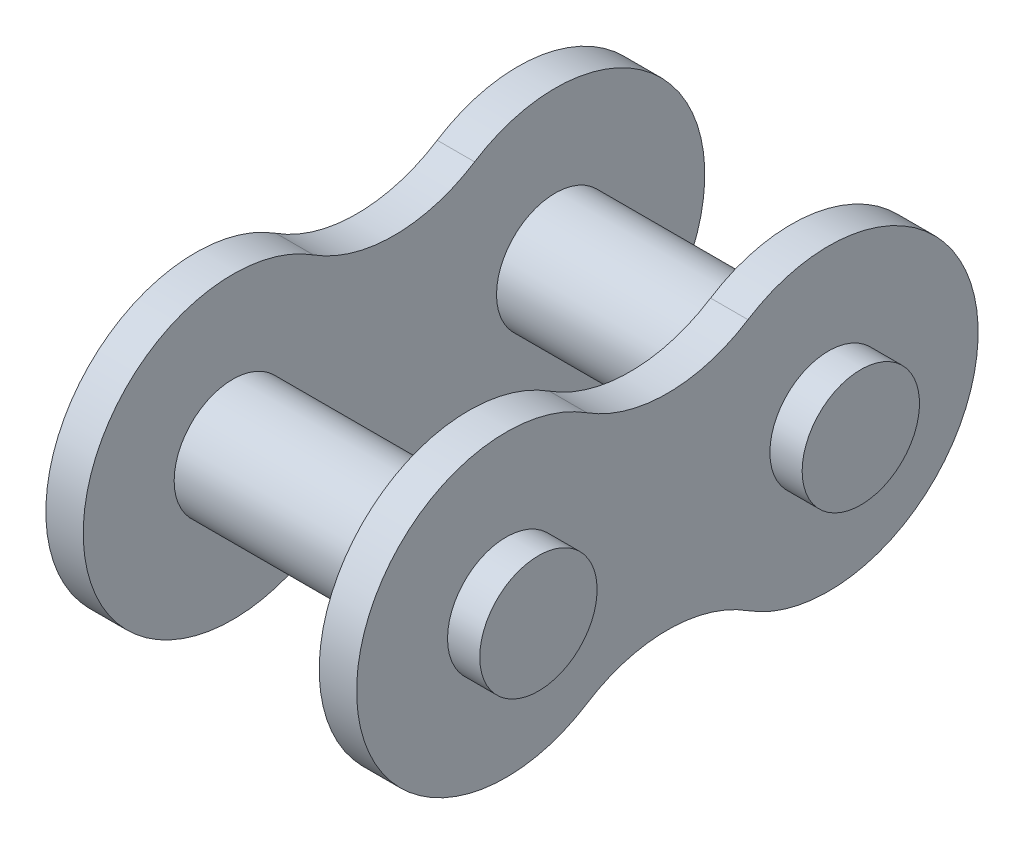
ISO-10303-21;
HEADER;
FILE_DESCRIPTION(('STEP AP214'),'2;1');
FILE_NAME('part.step','',(''),(''),'','','');
FILE_SCHEMA(('AUTOMOTIVE_DESIGN { 1 0 10303 214 1 1 1 1 }'));
ENDSEC;
DATA;
#1=APPLICATION_CONTEXT('core data for automotive mechanical design processes');
#2=APPLICATION_PROTOCOL_DEFINITION('international standard','automotive_design',2000,#1);
#3=PRODUCT_CONTEXT('',#1,'mechanical');
#4=PRODUCT('Part','Part','',(#3));
#5=PRODUCT_RELATED_PRODUCT_CATEGORY('part','',(#4));
#6=PRODUCT_DEFINITION_FORMATION('','',#4);
#7=PRODUCT_DEFINITION_CONTEXT('part definition',#1,'design');
#8=PRODUCT_DEFINITION('design','',#6,#7);
#9=PRODUCT_DEFINITION_SHAPE('','',#8);
#10=(LENGTH_UNIT() NAMED_UNIT(*) SI_UNIT(.MILLI.,.METRE.));
#11=(NAMED_UNIT(*) PLANE_ANGLE_UNIT() SI_UNIT($,.RADIAN.));
#12=(NAMED_UNIT(*) SI_UNIT($,.STERADIAN.) SOLID_ANGLE_UNIT());
#13=UNCERTAINTY_MEASURE_WITH_UNIT(LENGTH_MEASURE(1.E-05),#10,'distance_accuracy_value','');
#14=(GEOMETRIC_REPRESENTATION_CONTEXT(3) GLOBAL_UNCERTAINTY_ASSIGNED_CONTEXT((#13)) GLOBAL_UNIT_ASSIGNED_CONTEXT((#10,
#11,#12)) REPRESENTATION_CONTEXT('',''));
#15=CARTESIAN_POINT('',(0.,0.,0.));
#16=DIRECTION('',(0.,0.,1.));
#17=DIRECTION('',(1.,0.,0.));
#18=AXIS2_PLACEMENT_3D('',#15,#16,#17);
#19=CARTESIAN_POINT('',(0.7366,4.96431937328774,-3.175));
#20=DIRECTION('',(-1.,0.,0.));
#21=DIRECTION('',(0.,0.,1.));
#22=AXIS2_PLACEMENT_3D('',#19,#20,#21);
#23=CYLINDRICAL_SURFACE('',#22,2.9464);
#24=CARTESIAN_POINT('',(0.,4.96431937328774,-3.175));
#25=DIRECTION('',(-1.,0.,0.));
#26=DIRECTION('',(0.,0.,-1.));
#27=AXIS2_PLACEMENT_3D('',#24,#25,#26);
#28=CIRCLE('',#27,2.9464);
#29=CARTESIAN_POINT('',(0.,2.48215968664387,-4.7625));
#30=VERTEX_POINT('',#29);
#31=CARTESIAN_POINT('',(0.,2.48215968664387,-1.5875));
#32=VERTEX_POINT('',#31);
#33=EDGE_CURVE('E174',#30,#32,#28,.T.);
#34=ORIENTED_EDGE('',*,*,#33,.T.);
#35=DIRECTION('',(-1.,0.,0.));
#36=VECTOR('',#35,1.);
#37=CARTESIAN_POINT('',(0.7366,2.48215968664387,-1.5875));
#38=LINE('',#37,#36);
#39=CARTESIAN_POINT('',(0.7366,2.48215968664387,-1.5875));
#40=VERTEX_POINT('',#39);
#41=EDGE_CURVE('E195',#40,#32,#38,.T.);
#42=ORIENTED_EDGE('',*,*,#41,.F.);
#43=CARTESIAN_POINT('',(0.7366,4.96431937328774,-3.175));
#44=DIRECTION('',(-1.,0.,0.));
#45=DIRECTION('',(0.,0.,-1.));
#46=AXIS2_PLACEMENT_3D('',#43,#44,#45);
#47=CIRCLE('',#46,2.9464);
#48=CARTESIAN_POINT('',(0.7366,2.48215968664387,-4.7625));
#49=VERTEX_POINT('',#48);
#50=EDGE_CURVE('E177',#49,#40,#47,.T.);
#51=ORIENTED_EDGE('',*,*,#50,.F.);
#52=DIRECTION('',(-1.,0.,0.));
#53=VECTOR('',#52,1.);
#54=CARTESIAN_POINT('',(0.7366,2.48215968664387,-4.7625));
#55=LINE('',#54,#53);
#56=EDGE_CURVE('E183',#49,#30,#55,.T.);
#57=ORIENTED_EDGE('',*,*,#56,.T.);
#58=EDGE_LOOP('',(#34,#42,#51,#57));
#59=FACE_BOUND('',#58,.T.);
#60=ADVANCED_FACE('F39',(#59),#23,.F.);
#61=CARTESIAN_POINT('',(0.7366,0.,0.));
#62=DIRECTION('',(-1.,0.,0.));
#63=DIRECTION('',(0.,0.,1.));
#64=AXIS2_PLACEMENT_3D('',#61,#62,#63);
#65=CYLINDRICAL_SURFACE('',#64,2.9464);
#66=CARTESIAN_POINT('',(0.,0.,0.));
#67=DIRECTION('',(1.,0.,0.));
#68=DIRECTION('',(0.,0.,-1.));
#69=AXIS2_PLACEMENT_3D('',#66,#67,#68);
#70=CIRCLE('',#69,2.9464);
#71=CARTESIAN_POINT('',(0.,-2.48215968664387,-1.5875));
#72=VERTEX_POINT('',#71);
#73=EDGE_CURVE('E186',#32,#72,#70,.T.);
#74=ORIENTED_EDGE('',*,*,#73,.T.);
#75=DIRECTION('',(-1.,0.,0.));
#76=VECTOR('',#75,1.);
#77=CARTESIAN_POINT('',(0.7366,-2.48215968664387,-1.5875));
#78=LINE('',#77,#76);
#79=CARTESIAN_POINT('',(0.7366,-2.48215968664387,-1.5875));
#80=VERTEX_POINT('',#79);
#81=EDGE_CURVE('E193',#80,#72,#78,.T.);
#82=ORIENTED_EDGE('',*,*,#81,.F.);
#83=CARTESIAN_POINT('',(0.7366,0.,0.));
#84=DIRECTION('',(1.,0.,0.));
#85=DIRECTION('',(0.,0.,-1.));
#86=AXIS2_PLACEMENT_3D('',#83,#84,#85);
#87=CIRCLE('',#86,2.9464);
#88=EDGE_CURVE('E87',#40,#80,#87,.T.);
#89=ORIENTED_EDGE('',*,*,#88,.F.);
#90=ORIENTED_EDGE('',*,*,#41,.T.);
#91=EDGE_LOOP('',(#74,#82,#89,#90));
#92=FACE_BOUND('',#91,.T.);
#93=ADVANCED_FACE('F215',(#92),#65,.T.);
#94=CARTESIAN_POINT('',(0.7366,-4.96431937328774,-3.175));
#95=DIRECTION('',(-1.,0.,0.));
#96=DIRECTION('',(0.,0.,1.));
#97=AXIS2_PLACEMENT_3D('',#94,#95,#96);
#98=CYLINDRICAL_SURFACE('',#97,2.9464);
#99=CARTESIAN_POINT('',(0.,-4.96431937328774,-3.175));
#100=DIRECTION('',(-1.,0.,0.));
#101=DIRECTION('',(0.,0.,1.));
#102=AXIS2_PLACEMENT_3D('',#99,#100,#101);
#103=CIRCLE('',#102,2.9464);
#104=CARTESIAN_POINT('',(0.,-2.48215968664387,-4.7625));
#105=VERTEX_POINT('',#104);
#106=EDGE_CURVE('E73',#72,#105,#103,.T.);
#107=ORIENTED_EDGE('',*,*,#106,.T.);
#108=DIRECTION('',(-1.,0.,0.));
#109=VECTOR('',#108,1.);
#110=CARTESIAN_POINT('',(0.7366,-2.48215968664387,-4.7625));
#111=LINE('',#110,#109);
#112=CARTESIAN_POINT('',(0.7366,-2.48215968664387,-4.7625));
#113=VERTEX_POINT('',#112);
#114=EDGE_CURVE('E191',#113,#105,#111,.T.);
#115=ORIENTED_EDGE('',*,*,#114,.F.);
#116=CARTESIAN_POINT('',(0.7366,-4.96431937328774,-3.175));
#117=DIRECTION('',(-1.,0.,0.));
#118=DIRECTION('',(0.,0.,1.));
#119=AXIS2_PLACEMENT_3D('',#116,#117,#118);
#120=CIRCLE('',#119,2.9464);
#121=EDGE_CURVE('E180',#80,#113,#120,.T.);
#122=ORIENTED_EDGE('',*,*,#121,.F.);
#123=ORIENTED_EDGE('',*,*,#81,.T.);
#124=EDGE_LOOP('',(#107,#115,#122,#123));
#125=FACE_BOUND('',#124,.T.);
#126=ADVANCED_FACE('F214',(#125),#98,.F.);
#127=CARTESIAN_POINT('',(0.7366,0.,-6.35));
#128=DIRECTION('',(-1.,0.,0.));
#129=DIRECTION('',(0.,0.,1.));
#130=AXIS2_PLACEMENT_3D('',#127,#128,#129);
#131=CYLINDRICAL_SURFACE('',#130,2.9464);
#132=CARTESIAN_POINT('',(0.,0.,-6.35));
#133=DIRECTION('',(1.,0.,0.));
#134=DIRECTION('',(0.,0.,-1.));
#135=AXIS2_PLACEMENT_3D('',#132,#133,#134);
#136=CIRCLE('',#135,2.9464);
#137=EDGE_CURVE('E79',#105,#30,#136,.T.);
#138=ORIENTED_EDGE('',*,*,#137,.T.);
#139=ORIENTED_EDGE('',*,*,#56,.F.);
#140=CARTESIAN_POINT('',(0.7366,0.,-6.35));
#141=DIRECTION('',(1.,0.,0.));
#142=DIRECTION('',(0.,0.,-1.));
#143=AXIS2_PLACEMENT_3D('',#140,#141,#142);
#144=CIRCLE('',#143,2.9464);
#145=EDGE_CURVE('E55',#113,#49,#144,.T.);
#146=ORIENTED_EDGE('',*,*,#145,.F.);
#147=ORIENTED_EDGE('',*,*,#114,.T.);
#148=EDGE_LOOP('',(#138,#139,#146,#147));
#149=FACE_BOUND('',#148,.T.);
#150=ADVANCED_FACE('F212',(#149),#131,.T.);
#151=CARTESIAN_POINT('',(0.7366,2.48215968664387,-4.7625));
#152=DIRECTION('',(1.,0.,0.));
#153=DIRECTION('',(0.,0.,-1.));
#154=AXIS2_PLACEMENT_3D('',#151,#152,#153);
#155=PLANE('',#154);
#156=CARTESIAN_POINT('',(0.7366,0.,-6.35));
#157=DIRECTION('',(1.,0.,0.));
#158=DIRECTION('',(0.,0.,-1.));
#159=AXIS2_PLACEMENT_3D('',#156,#157,#158);
#160=CIRCLE('',#159,1.1557);
#161=CARTESIAN_POINT('',(0.7366,0.,-5.1943));
#162=VERTEX_POINT('',#161);
#163=EDGE_CURVE('E165',#162,#162,#160,.T.);
#164=ORIENTED_EDGE('',*,*,#163,.F.);
#165=EDGE_LOOP('',(#164));
#166=FACE_BOUND('',#165,.T.);
#167=CARTESIAN_POINT('',(0.7366,0.,0.));
#168=DIRECTION('',(1.,0.,0.));
#169=DIRECTION('',(0.,0.,-1.));
#170=AXIS2_PLACEMENT_3D('',#167,#168,#169);
#171=CIRCLE('',#170,1.1557);
#172=CARTESIAN_POINT('',(0.7366,0.,1.1557));
#173=VERTEX_POINT('',#172);
#174=EDGE_CURVE('E168',#173,#173,#171,.T.);
#175=ORIENTED_EDGE('',*,*,#174,.F.);
#176=EDGE_LOOP('',(#175));
#177=FACE_BOUND('',#176,.T.);
#178=ORIENTED_EDGE('',*,*,#50,.T.);
#179=ORIENTED_EDGE('',*,*,#88,.T.);
#180=ORIENTED_EDGE('',*,*,#121,.T.);
#181=ORIENTED_EDGE('',*,*,#145,.T.);
#182=EDGE_LOOP('',(#178,#179,#180,#181));
#183=FACE_BOUND('',#182,.T.);
#184=ADVANCED_FACE('F205',(#166,#177,#183),#155,.T.);
#185=CARTESIAN_POINT('',(0.,2.48215968664387,-4.7625));
#186=DIRECTION('',(1.,0.,0.));
#187=DIRECTION('',(0.,0.,-1.));
#188=AXIS2_PLACEMENT_3D('',#185,#186,#187);
#189=PLANE('',#188);
#190=CARTESIAN_POINT('',(0.,0.,-6.35));
#191=DIRECTION('',(1.,0.,0.));
#192=DIRECTION('',(0.,0.,-1.));
#193=AXIS2_PLACEMENT_3D('',#190,#191,#192);
#194=CIRCLE('',#193,1.1557);
#195=CARTESIAN_POINT('',(0.,0.,-7.5057));
#196=VERTEX_POINT('',#195);
#197=EDGE_CURVE('E11',#196,#196,#194,.F.);
#198=ORIENTED_EDGE('',*,*,#197,.F.);
#199=EDGE_LOOP('',(#198));
#200=FACE_BOUND('',#199,.T.);
#201=CARTESIAN_POINT('',(0.,0.,0.));
#202=DIRECTION('',(1.,0.,0.));
#203=DIRECTION('',(0.,0.,-1.));
#204=AXIS2_PLACEMENT_3D('',#201,#202,#203);
#205=CIRCLE('',#204,1.1557);
#206=CARTESIAN_POINT('',(0.,0.,-1.1557));
#207=VERTEX_POINT('',#206);
#208=EDGE_CURVE('E47',#207,#207,#205,.F.);
#209=ORIENTED_EDGE('',*,*,#208,.F.);
#210=EDGE_LOOP('',(#209));
#211=FACE_BOUND('',#210,.T.);
#212=ORIENTED_EDGE('',*,*,#33,.F.);
#213=ORIENTED_EDGE('',*,*,#137,.F.);
#214=ORIENTED_EDGE('',*,*,#106,.F.);
#215=ORIENTED_EDGE('',*,*,#73,.F.);
#216=EDGE_LOOP('',(#212,#213,#214,#215));
#217=FACE_BOUND('',#216,.T.);
#218=ADVANCED_FACE('F201',(#200,#211,#217),#189,.F.);
#219=CARTESIAN_POINT('',(5.3848,0.,0.));
#220=DIRECTION('',(-1.,0.,0.));
#221=DIRECTION('',(0.,0.,1.));
#222=AXIS2_PLACEMENT_3D('',#219,#220,#221);
#223=CYLINDRICAL_SURFACE('',#222,1.1557);
#224=CARTESIAN_POINT('',(5.3848,0.,0.));
#225=DIRECTION('',(1.,0.,0.));
#226=DIRECTION('',(0.,0.,-1.));
#227=AXIS2_PLACEMENT_3D('',#224,#225,#226);
#228=CIRCLE('',#227,1.1557);
#229=CARTESIAN_POINT('',(5.3848,0.,1.1557));
#230=VERTEX_POINT('',#229);
#231=EDGE_CURVE('E171',#230,#230,#228,.T.);
#232=CARTESIAN_POINT('',(5.3848,0.,1.1557));
#233=CARTESIAN_POINT('',(5.33638125,0.,1.1557));
#234=CARTESIAN_POINT('',(5.2879625,0.,1.1557));
#235=CARTESIAN_POINT('',(5.191125,0.,1.1557));
#236=CARTESIAN_POINT('',(5.14270625,0.,1.1557));
#237=CARTESIAN_POINT('',(5.04586875,0.,1.1557));
#238=CARTESIAN_POINT('',(4.99745,0.,1.1557));
#239=CARTESIAN_POINT('',(4.9006125,0.,1.1557));
#240=CARTESIAN_POINT('',(4.85219375,0.,1.1557));
#241=CARTESIAN_POINT('',(4.75535625,0.,1.1557));
#242=CARTESIAN_POINT('',(4.7069375,0.,1.1557));
#243=CARTESIAN_POINT('',(4.6101,0.,1.1557));
#244=CARTESIAN_POINT('',(4.56168125,0.,1.1557));
#245=CARTESIAN_POINT('',(4.46484375,0.,1.1557));
#246=CARTESIAN_POINT('',(4.416425,0.,1.1557));
#247=CARTESIAN_POINT('',(4.3195875,0.,1.1557));
#248=CARTESIAN_POINT('',(4.27116875,0.,1.1557));
#249=CARTESIAN_POINT('',(4.17433125,0.,1.1557));
#250=CARTESIAN_POINT('',(4.1259125,0.,1.1557));
#251=CARTESIAN_POINT('',(4.029075,0.,1.1557));
#252=CARTESIAN_POINT('',(3.98065625,0.,1.1557));
#253=CARTESIAN_POINT('',(3.88381875,0.,1.1557));
#254=CARTESIAN_POINT('',(3.8354,0.,1.1557));
#255=CARTESIAN_POINT('',(3.7385625,0.,1.1557));
#256=CARTESIAN_POINT('',(3.69014375,0.,1.1557));
#257=CARTESIAN_POINT('',(3.59330625,0.,1.1557));
#258=CARTESIAN_POINT('',(3.5448875,0.,1.1557));
#259=CARTESIAN_POINT('',(3.44805,0.,1.1557));
#260=CARTESIAN_POINT('',(3.39963125,0.,1.1557));
#261=CARTESIAN_POINT('',(3.30279375,0.,1.1557));
#262=CARTESIAN_POINT('',(3.254375,0.,1.1557));
#263=CARTESIAN_POINT('',(3.1575375,0.,1.1557));
#264=CARTESIAN_POINT('',(3.10911875,0.,1.1557));
#265=CARTESIAN_POINT('',(3.01228125,0.,1.1557));
#266=CARTESIAN_POINT('',(2.9638625,0.,1.1557));
#267=CARTESIAN_POINT('',(2.867025,0.,1.1557));
#268=CARTESIAN_POINT('',(2.81860625,0.,1.1557));
#269=CARTESIAN_POINT('',(2.72176875,0.,1.1557));
#270=CARTESIAN_POINT('',(2.67335,0.,1.1557));
#271=CARTESIAN_POINT('',(2.5765125,0.,1.1557));
#272=CARTESIAN_POINT('',(2.52809375,0.,1.1557));
#273=CARTESIAN_POINT('',(2.43125625,0.,1.1557));
#274=CARTESIAN_POINT('',(2.3828375,0.,1.1557));
#275=CARTESIAN_POINT('',(2.286,0.,1.1557));
#276=CARTESIAN_POINT('',(2.23758125,0.,1.1557));
#277=CARTESIAN_POINT('',(2.14074375,0.,1.1557));
#278=CARTESIAN_POINT('',(2.092325,0.,1.1557));
#279=CARTESIAN_POINT('',(1.9954875,0.,1.1557));
#280=CARTESIAN_POINT('',(1.94706875,0.,1.1557));
#281=CARTESIAN_POINT('',(1.85023125,0.,1.1557));
#282=CARTESIAN_POINT('',(1.8018125,0.,1.1557));
#283=CARTESIAN_POINT('',(1.704975,0.,1.1557));
#284=CARTESIAN_POINT('',(1.65655625,0.,1.1557));
#285=CARTESIAN_POINT('',(1.55971875,0.,1.1557));
#286=CARTESIAN_POINT('',(1.5113,0.,1.1557));
#287=CARTESIAN_POINT('',(1.4144625,0.,1.1557));
#288=CARTESIAN_POINT('',(1.36604375,0.,1.1557));
#289=CARTESIAN_POINT('',(1.26920625,0.,1.1557));
#290=CARTESIAN_POINT('',(1.2207875,0.,1.1557));
#291=CARTESIAN_POINT('',(1.12395,0.,1.1557));
#292=CARTESIAN_POINT('',(1.07553125,0.,1.1557));
#293=CARTESIAN_POINT('',(0.97869375,0.,1.1557));
#294=CARTESIAN_POINT('',(0.930275,0.,1.1557));
#295=CARTESIAN_POINT('',(0.833437499999999,0.,1.1557));
#296=CARTESIAN_POINT('',(0.785018749999999,0.,1.1557));
#297=CARTESIAN_POINT('',(0.7366,0.,1.1557));
#298=B_SPLINE_CURVE_WITH_KNOTS('',3,(#232,#233,#234,#235,#236,#237,#238,#239,#240,#241,#242,
#243,#244,#245,#246,#247,#248,#249,#250,#251,#252,#253,#254,#255,#256,#257,#258,#259,#260,#261,
#262,#263,#264,#265,#266,#267,#268,#269,#270,#271,#272,#273,#274,#275,#276,#277,#278,#279,#280,
#281,#282,#283,#284,#285,#286,#287,#288,#289,#290,#291,#292,#293,#294,#295,#296,#297),
.UNSPECIFIED.,.F.,.F.,(4,2,2,2,2,2,2,2,2,2,2,2,2,2,2,2,2,2,2,2,2,2,2,2,2,2,2,2,2,2,2,2,4),(0.,
0.14525625,0.290512499999999,0.435768749999999,0.581025,0.72628125,0.871537499999999,1.01679375,
1.16205,1.30730625,1.4525625,1.59781875,1.743075,1.88833125,2.0335875,2.17884375,2.3241,
2.46935625,2.6146125,2.75986875,2.905125,3.05038125,3.1956375,3.34089375,3.48615,3.63140625,
3.7766625,3.92191875,4.067175,4.21243125,4.3576875,4.50294375,4.6482),.UNSPECIFIED.);
#299=EDGE_CURVE('BSEAM204',#230,#173,#298,.T.);
#300=ORIENTED_EDGE('',*,*,#231,.F.);
#301=ORIENTED_EDGE('',*,*,#174,.T.);
#302=ORIENTED_EDGE('',*,*,#299,.T.);
#303=ORIENTED_EDGE('',*,*,#299,.F.);
#304=EDGE_LOOP('',(#300,#302,#301,#303));
#305=FACE_BOUND('',#304,.T.);
#306=ADVANCED_FACE('F204',(#305),#223,.T.);
#307=CARTESIAN_POINT('',(5.3848,0.,-6.35));
#308=DIRECTION('',(-1.,0.,0.));
#309=DIRECTION('',(0.,0.,1.));
#310=AXIS2_PLACEMENT_3D('',#307,#308,#309);
#311=CYLINDRICAL_SURFACE('',#310,1.1557);
#312=CARTESIAN_POINT('',(5.3848,0.,-6.35));
#313=DIRECTION('',(1.,0.,0.));
#314=DIRECTION('',(0.,0.,-1.));
#315=AXIS2_PLACEMENT_3D('',#312,#313,#314);
#316=CIRCLE('',#315,1.1557);
#317=CARTESIAN_POINT('',(5.3848,0.,-5.1943));
#318=VERTEX_POINT('',#317);
#319=EDGE_CURVE('E164',#318,#318,#316,.T.);
#320=CARTESIAN_POINT('',(5.3848,0.,-5.1943));
#321=CARTESIAN_POINT('',(5.33638125,0.,-5.1943));
#322=CARTESIAN_POINT('',(5.2879625,0.,-5.1943));
#323=CARTESIAN_POINT('',(5.191125,0.,-5.1943));
#324=CARTESIAN_POINT('',(5.14270625,0.,-5.1943));
#325=CARTESIAN_POINT('',(5.04586875,0.,-5.1943));
#326=CARTESIAN_POINT('',(4.99745,0.,-5.1943));
#327=CARTESIAN_POINT('',(4.9006125,0.,-5.1943));
#328=CARTESIAN_POINT('',(4.85219375,0.,-5.1943));
#329=CARTESIAN_POINT('',(4.75535625,0.,-5.1943));
#330=CARTESIAN_POINT('',(4.7069375,0.,-5.1943));
#331=CARTESIAN_POINT('',(4.6101,0.,-5.1943));
#332=CARTESIAN_POINT('',(4.56168125,0.,-5.1943));
#333=CARTESIAN_POINT('',(4.46484375,0.,-5.1943));
#334=CARTESIAN_POINT('',(4.416425,0.,-5.1943));
#335=CARTESIAN_POINT('',(4.3195875,0.,-5.1943));
#336=CARTESIAN_POINT('',(4.27116875,0.,-5.1943));
#337=CARTESIAN_POINT('',(4.17433125,0.,-5.1943));
#338=CARTESIAN_POINT('',(4.1259125,0.,-5.1943));
#339=CARTESIAN_POINT('',(4.029075,0.,-5.1943));
#340=CARTESIAN_POINT('',(3.98065625,0.,-5.1943));
#341=CARTESIAN_POINT('',(3.88381875,0.,-5.1943));
#342=CARTESIAN_POINT('',(3.8354,0.,-5.1943));
#343=CARTESIAN_POINT('',(3.7385625,0.,-5.1943));
#344=CARTESIAN_POINT('',(3.69014375,0.,-5.1943));
#345=CARTESIAN_POINT('',(3.59330625,0.,-5.1943));
#346=CARTESIAN_POINT('',(3.5448875,0.,-5.1943));
#347=CARTESIAN_POINT('',(3.44805,0.,-5.1943));
#348=CARTESIAN_POINT('',(3.39963125,0.,-5.1943));
#349=CARTESIAN_POINT('',(3.30279375,0.,-5.1943));
#350=CARTESIAN_POINT('',(3.254375,0.,-5.1943));
#351=CARTESIAN_POINT('',(3.1575375,0.,-5.1943));
#352=CARTESIAN_POINT('',(3.10911875,0.,-5.1943));
#353=CARTESIAN_POINT('',(3.01228125,0.,-5.1943));
#354=CARTESIAN_POINT('',(2.9638625,0.,-5.1943));
#355=CARTESIAN_POINT('',(2.867025,0.,-5.1943));
#356=CARTESIAN_POINT('',(2.81860625,0.,-5.1943));
#357=CARTESIAN_POINT('',(2.72176875,0.,-5.1943));
#358=CARTESIAN_POINT('',(2.67335,0.,-5.1943));
#359=CARTESIAN_POINT('',(2.5765125,0.,-5.1943));
#360=CARTESIAN_POINT('',(2.52809375,0.,-5.1943));
#361=CARTESIAN_POINT('',(2.43125625,0.,-5.1943));
#362=CARTESIAN_POINT('',(2.3828375,0.,-5.1943));
#363=CARTESIAN_POINT('',(2.286,0.,-5.1943));
#364=CARTESIAN_POINT('',(2.23758125,0.,-5.1943));
#365=CARTESIAN_POINT('',(2.14074375,0.,-5.1943));
#366=CARTESIAN_POINT('',(2.092325,0.,-5.1943));
#367=CARTESIAN_POINT('',(1.9954875,0.,-5.1943));
#368=CARTESIAN_POINT('',(1.94706875,0.,-5.1943));
#369=CARTESIAN_POINT('',(1.85023125,0.,-5.1943));
#370=CARTESIAN_POINT('',(1.8018125,0.,-5.1943));
#371=CARTESIAN_POINT('',(1.704975,0.,-5.1943));
#372=CARTESIAN_POINT('',(1.65655625,0.,-5.1943));
#373=CARTESIAN_POINT('',(1.55971875,0.,-5.1943));
#374=CARTESIAN_POINT('',(1.5113,0.,-5.1943));
#375=CARTESIAN_POINT('',(1.4144625,0.,-5.1943));
#376=CARTESIAN_POINT('',(1.36604375,0.,-5.1943));
#377=CARTESIAN_POINT('',(1.26920625,0.,-5.1943));
#378=CARTESIAN_POINT('',(1.2207875,0.,-5.1943));
#379=CARTESIAN_POINT('',(1.12395,0.,-5.1943));
#380=CARTESIAN_POINT('',(1.07553125,0.,-5.1943));
#381=CARTESIAN_POINT('',(0.97869375,0.,-5.1943));
#382=CARTESIAN_POINT('',(0.930275,0.,-5.1943));
#383=CARTESIAN_POINT('',(0.833437499999999,0.,-5.1943));
#384=CARTESIAN_POINT('',(0.785018749999999,0.,-5.1943));
#385=CARTESIAN_POINT('',(0.7366,0.,-5.1943));
#386=B_SPLINE_CURVE_WITH_KNOTS('',3,(#320,#321,#322,#323,#324,#325,#326,#327,#328,#329,#330,
#331,#332,#333,#334,#335,#336,#337,#338,#339,#340,#341,#342,#343,#344,#345,#346,#347,#348,#349,
#350,#351,#352,#353,#354,#355,#356,#357,#358,#359,#360,#361,#362,#363,#364,#365,#366,#367,#368,
#369,#370,#371,#372,#373,#374,#375,#376,#377,#378,#379,#380,#381,#382,#383,#384,#385),
.UNSPECIFIED.,.F.,.F.,(4,2,2,2,2,2,2,2,2,2,2,2,2,2,2,2,2,2,2,2,2,2,2,2,2,2,2,2,2,2,2,2,4),(0.,
0.14525625,0.290512499999999,0.435768749999999,0.581025,0.72628125,0.871537499999999,1.01679375,
1.16205,1.30730625,1.4525625,1.59781875,1.743075,1.88833125,2.0335875,2.17884375,2.3241,
2.46935625,2.6146125,2.75986875,2.905125,3.05038125,3.1956375,3.34089375,3.48615,3.63140625,
3.7766625,3.92191875,4.067175,4.21243125,4.3576875,4.50294375,4.6482),.UNSPECIFIED.);
#387=EDGE_CURVE('BSEAM230',#318,#162,#386,.T.);
#388=ORIENTED_EDGE('',*,*,#319,.F.);
#389=ORIENTED_EDGE('',*,*,#163,.T.);
#390=ORIENTED_EDGE('',*,*,#387,.T.);
#391=ORIENTED_EDGE('',*,*,#387,.F.);
#392=EDGE_LOOP('',(#388,#390,#389,#391));
#393=FACE_BOUND('',#392,.T.);
#394=ADVANCED_FACE('F230',(#393),#311,.T.);
#395=CARTESIAN_POINT('',(-0.635,0.,0.));
#396=DIRECTION('',(1.,0.,0.));
#397=DIRECTION('',(0.,0.,-1.));
#398=AXIS2_PLACEMENT_3D('',#395,#396,#397);
#399=CYLINDRICAL_SURFACE('',#398,1.1557);
#400=CARTESIAN_POINT('',(-0.635,0.,0.));
#401=DIRECTION('',(-1.,0.,0.));
#402=DIRECTION('',(0.,0.,1.));
#403=AXIS2_PLACEMENT_3D('',#400,#401,#402);
#404=CIRCLE('',#403,1.1557);
#405=CARTESIAN_POINT('',(-0.635,0.,1.1557));
#406=VERTEX_POINT('',#405);
#407=EDGE_CURVE('E161',#406,#406,#404,.T.);
#408=ORIENTED_EDGE('',*,*,#407,.F.);
#409=EDGE_LOOP('',(#408));
#410=FACE_BOUND('',#409,.T.);
#411=ORIENTED_EDGE('',*,*,#208,.T.);
#412=EDGE_LOOP('',(#411));
#413=FACE_BOUND('',#412,.T.);
#414=ADVANCED_FACE('F199',(#410,#413),#399,.T.);
#415=CARTESIAN_POINT('',(-0.635,0.,0.));
#416=DIRECTION('',(-1.,0.,0.));
#417=DIRECTION('',(0.,0.,1.));
#418=AXIS2_PLACEMENT_3D('',#415,#416,#417);
#419=PLANE('',#418);
#420=ORIENTED_EDGE('',*,*,#407,.T.);
#421=EDGE_LOOP('',(#420));
#422=FACE_BOUND('',#421,.T.);
#423=ADVANCED_FACE('F237',(#422),#419,.T.);
#424=CARTESIAN_POINT('',(-0.635,0.,-6.35));
#425=DIRECTION('',(1.,0.,0.));
#426=DIRECTION('',(0.,0.,-1.));
#427=AXIS2_PLACEMENT_3D('',#424,#425,#426);
#428=CYLINDRICAL_SURFACE('',#427,1.1557);
#429=CARTESIAN_POINT('',(-0.635,0.,-6.35));
#430=DIRECTION('',(-1.,0.,0.));
#431=DIRECTION('',(0.,0.,1.));
#432=AXIS2_PLACEMENT_3D('',#429,#430,#431);
#433=CIRCLE('',#432,1.1557);
#434=CARTESIAN_POINT('',(-0.635,0.,-5.1943));
#435=VERTEX_POINT('',#434);
#436=EDGE_CURVE('E125',#435,#435,#433,.T.);
#437=ORIENTED_EDGE('',*,*,#436,.F.);
#438=EDGE_LOOP('',(#437));
#439=FACE_BOUND('',#438,.T.);
#440=ORIENTED_EDGE('',*,*,#197,.T.);
#441=EDGE_LOOP('',(#440));
#442=FACE_BOUND('',#441,.T.);
#443=ADVANCED_FACE('F241',(#439,#442),#428,.T.);
#444=CARTESIAN_POINT('',(-0.635,0.,-6.35));
#445=DIRECTION('',(-1.,0.,0.));
#446=DIRECTION('',(0.,0.,1.));
#447=AXIS2_PLACEMENT_3D('',#444,#445,#446);
#448=PLANE('',#447);
#449=ORIENTED_EDGE('',*,*,#436,.T.);
#450=EDGE_LOOP('',(#449));
#451=FACE_BOUND('',#450,.T.);
#452=ADVANCED_FACE('F243',(#451),#448,.T.);
#453=CARTESIAN_POINT('',(5.3848,4.96431937328774,-3.175));
#454=DIRECTION('',(1.,0.,0.));
#455=DIRECTION('',(0.,0.,-1.));
#456=AXIS2_PLACEMENT_3D('',#453,#454,#455);
#457=CYLINDRICAL_SURFACE('',#456,2.9464);
#458=CARTESIAN_POINT('',(6.1214,4.96431937328774,-3.175));
#459=DIRECTION('',(-1.,0.,0.));
#460=DIRECTION('',(0.,0.,-1.));
#461=AXIS2_PLACEMENT_3D('',#458,#459,#460);
#462=CIRCLE('',#461,2.9464);
#463=CARTESIAN_POINT('',(6.1214,2.48215968664387,-4.7625));
#464=VERTEX_POINT('',#463);
#465=CARTESIAN_POINT('',(6.1214,2.48215968664387,-1.5875));
#466=VERTEX_POINT('',#465);
#467=EDGE_CURVE('E120',#464,#466,#462,.T.);
#468=ORIENTED_EDGE('',*,*,#467,.F.);
#469=DIRECTION('',(1.,0.,0.));
#470=VECTOR('',#469,1.);
#471=CARTESIAN_POINT('',(5.3848,2.48215968664387,-4.7625));
#472=LINE('',#471,#470);
#473=CARTESIAN_POINT('',(5.3848,2.48215968664387,-4.7625));
#474=VERTEX_POINT('',#473);
#475=EDGE_CURVE('E114',#474,#464,#472,.T.);
#476=ORIENTED_EDGE('',*,*,#475,.F.);
#477=CARTESIAN_POINT('',(5.3848,4.96431937328774,-3.175));
#478=DIRECTION('',(-1.,0.,0.));
#479=DIRECTION('',(0.,0.,-1.));
#480=AXIS2_PLACEMENT_3D('',#477,#478,#479);
#481=CIRCLE('',#480,2.9464);
#482=CARTESIAN_POINT('',(5.3848,2.48215968664387,-1.5875));
#483=VERTEX_POINT('',#482);
#484=EDGE_CURVE('E117',#474,#483,#481,.T.);
#485=ORIENTED_EDGE('',*,*,#484,.T.);
#486=DIRECTION('',(1.,0.,0.));
#487=VECTOR('',#486,1.);
#488=CARTESIAN_POINT('',(5.3848,2.48215968664387,-1.5875));
#489=LINE('',#488,#487);
#490=EDGE_CURVE('E145',#483,#466,#489,.T.);
#491=ORIENTED_EDGE('',*,*,#490,.T.);
#492=EDGE_LOOP('',(#468,#476,#485,#491));
#493=FACE_BOUND('',#492,.T.);
#494=ADVANCED_FACE('F116',(#493),#457,.F.);
#495=CARTESIAN_POINT('',(5.3848,0.,-6.35));
#496=DIRECTION('',(1.,0.,0.));
#497=DIRECTION('',(0.,0.,-1.));
#498=AXIS2_PLACEMENT_3D('',#495,#496,#497);
#499=CYLINDRICAL_SURFACE('',#498,2.9464);
#500=CARTESIAN_POINT('',(6.1214,0.,-6.35));
#501=DIRECTION('',(1.,0.,0.));
#502=DIRECTION('',(0.,0.,-1.));
#503=AXIS2_PLACEMENT_3D('',#500,#501,#502);
#504=CIRCLE('',#503,2.9464);
#505=CARTESIAN_POINT('',(6.1214,-2.48215968664387,-4.7625));
#506=VERTEX_POINT('',#505);
#507=EDGE_CURVE('E147',#506,#464,#504,.T.);
#508=ORIENTED_EDGE('',*,*,#507,.F.);
#509=DIRECTION('',(1.,0.,0.));
#510=VECTOR('',#509,1.);
#511=CARTESIAN_POINT('',(5.3848,-2.48215968664387,-4.7625));
#512=LINE('',#511,#510);
#513=CARTESIAN_POINT('',(5.3848,-2.48215968664387,-4.7625));
#514=VERTEX_POINT('',#513);
#515=EDGE_CURVE('E126',#514,#506,#512,.T.);
#516=ORIENTED_EDGE('',*,*,#515,.F.);
#517=CARTESIAN_POINT('',(5.3848,0.,-6.35));
#518=DIRECTION('',(1.,0.,0.));
#519=DIRECTION('',(0.,0.,-1.));
#520=AXIS2_PLACEMENT_3D('',#517,#518,#519);
#521=CIRCLE('',#520,2.9464);
#522=EDGE_CURVE('E132',#514,#474,#521,.T.);
#523=ORIENTED_EDGE('',*,*,#522,.T.);
#524=ORIENTED_EDGE('',*,*,#475,.T.);
#525=EDGE_LOOP('',(#508,#516,#523,#524));
#526=FACE_BOUND('',#525,.T.);
#527=ADVANCED_FACE('F138',(#526),#499,.T.);
#528=CARTESIAN_POINT('',(5.3848,-4.96431937328774,-3.175));
#529=DIRECTION('',(1.,0.,0.));
#530=DIRECTION('',(0.,0.,-1.));
#531=AXIS2_PLACEMENT_3D('',#528,#529,#530);
#532=CYLINDRICAL_SURFACE('',#531,2.9464);
#533=CARTESIAN_POINT('',(6.1214,-4.96431937328774,-3.175));
#534=DIRECTION('',(-1.,0.,0.));
#535=DIRECTION('',(0.,0.,1.));
#536=AXIS2_PLACEMENT_3D('',#533,#534,#535);
#537=CIRCLE('',#536,2.9464);
#538=CARTESIAN_POINT('',(6.1214,-2.48215968664387,-1.5875));
#539=VERTEX_POINT('',#538);
#540=EDGE_CURVE('E150',#539,#506,#537,.T.);
#541=ORIENTED_EDGE('',*,*,#540,.F.);
#542=DIRECTION('',(1.,0.,0.));
#543=VECTOR('',#542,1.);
#544=CARTESIAN_POINT('',(5.3848,-2.48215968664387,-1.5875));
#545=LINE('',#544,#543);
#546=CARTESIAN_POINT('',(5.3848,-2.48215968664387,-1.5875));
#547=VERTEX_POINT('',#546);
#548=EDGE_CURVE('E156',#547,#539,#545,.T.);
#549=ORIENTED_EDGE('',*,*,#548,.F.);
#550=CARTESIAN_POINT('',(5.3848,-4.96431937328774,-3.175));
#551=DIRECTION('',(-1.,0.,0.));
#552=DIRECTION('',(0.,0.,1.));
#553=AXIS2_PLACEMENT_3D('',#550,#551,#552);
#554=CIRCLE('',#553,2.9464);
#555=EDGE_CURVE('E139',#547,#514,#554,.T.);
#556=ORIENTED_EDGE('',*,*,#555,.T.);
#557=ORIENTED_EDGE('',*,*,#515,.T.);
#558=EDGE_LOOP('',(#541,#549,#556,#557));
#559=FACE_BOUND('',#558,.T.);
#560=ADVANCED_FACE('F254',(#559),#532,.F.);
#561=CARTESIAN_POINT('',(5.3848,0.,0.));
#562=DIRECTION('',(1.,0.,0.));
#563=DIRECTION('',(0.,0.,-1.));
#564=AXIS2_PLACEMENT_3D('',#561,#562,#563);
#565=CYLINDRICAL_SURFACE('',#564,2.9464);
#566=CARTESIAN_POINT('',(6.1214,0.,0.));
#567=DIRECTION('',(1.,0.,0.));
#568=DIRECTION('',(0.,0.,-1.));
#569=AXIS2_PLACEMENT_3D('',#566,#567,#568);
#570=CIRCLE('',#569,2.9464);
#571=EDGE_CURVE('E136',#466,#539,#570,.T.);
#572=ORIENTED_EDGE('',*,*,#571,.F.);
#573=ORIENTED_EDGE('',*,*,#490,.F.);
#574=CARTESIAN_POINT('',(5.3848,0.,0.));
#575=DIRECTION('',(1.,0.,0.));
#576=DIRECTION('',(0.,0.,-1.));
#577=AXIS2_PLACEMENT_3D('',#574,#575,#576);
#578=CIRCLE('',#577,2.9464);
#579=EDGE_CURVE('E135',#483,#547,#578,.T.);
#580=ORIENTED_EDGE('',*,*,#579,.T.);
#581=ORIENTED_EDGE('',*,*,#548,.T.);
#582=EDGE_LOOP('',(#572,#573,#580,#581));
#583=FACE_BOUND('',#582,.T.);
#584=ADVANCED_FACE('F257',(#583),#565,.T.);
#585=CARTESIAN_POINT('',(5.3848,2.48215968664387,-4.7625));
#586=DIRECTION('',(-1.,0.,0.));
#587=DIRECTION('',(0.,0.,-1.));
#588=AXIS2_PLACEMENT_3D('',#585,#586,#587);
#589=PLANE('',#588);
#590=ORIENTED_EDGE('',*,*,#231,.T.);
#591=EDGE_LOOP('',(#590));
#592=FACE_BOUND('',#591,.T.);
#593=ORIENTED_EDGE('',*,*,#319,.T.);
#594=EDGE_LOOP('',(#593));
#595=FACE_BOUND('',#594,.T.);
#596=ORIENTED_EDGE('',*,*,#484,.F.);
#597=ORIENTED_EDGE('',*,*,#522,.F.);
#598=ORIENTED_EDGE('',*,*,#555,.F.);
#599=ORIENTED_EDGE('',*,*,#579,.F.);
#600=EDGE_LOOP('',(#596,#597,#598,#599));
#601=FACE_BOUND('',#600,.T.);
#602=ADVANCED_FACE('F130',(#592,#595,#601),#589,.T.);
#603=CARTESIAN_POINT('',(6.1214,2.48215968664387,-4.7625));
#604=DIRECTION('',(-1.,0.,0.));
#605=DIRECTION('',(0.,0.,-1.));
#606=AXIS2_PLACEMENT_3D('',#603,#604,#605);
#607=PLANE('',#606);
#608=CARTESIAN_POINT('',(6.1214,0.,-6.35));
#609=DIRECTION('',(-1.,0.,0.));
#610=DIRECTION('',(0.,0.,1.));
#611=AXIS2_PLACEMENT_3D('',#608,#609,#610);
#612=CIRCLE('',#611,1.1557);
#613=CARTESIAN_POINT('',(6.1214,0.,-5.1943));
#614=VERTEX_POINT('',#613);
#615=EDGE_CURVE('E290',#614,#614,#612,.T.);
#616=ORIENTED_EDGE('',*,*,#615,.T.);
#617=EDGE_LOOP('',(#616));
#618=FACE_BOUND('',#617,.T.);
#619=CARTESIAN_POINT('',(6.1214,0.,0.));
#620=DIRECTION('',(-1.,0.,0.));
#621=DIRECTION('',(0.,0.,1.));
#622=AXIS2_PLACEMENT_3D('',#619,#620,#621);
#623=CIRCLE('',#622,1.1557);
#624=CARTESIAN_POINT('',(6.1214,0.,1.1557));
#625=VERTEX_POINT('',#624);
#626=EDGE_CURVE('E289',#625,#625,#623,.T.);
#627=ORIENTED_EDGE('',*,*,#626,.T.);
#628=EDGE_LOOP('',(#627));
#629=FACE_BOUND('',#628,.T.);
#630=ORIENTED_EDGE('',*,*,#467,.T.);
#631=ORIENTED_EDGE('',*,*,#571,.T.);
#632=ORIENTED_EDGE('',*,*,#540,.T.);
#633=ORIENTED_EDGE('',*,*,#507,.T.);
#634=EDGE_LOOP('',(#630,#631,#632,#633));
#635=FACE_BOUND('',#634,.T.);
#636=ADVANCED_FACE('F262',(#618,#629,#635),#607,.F.);
#637=CARTESIAN_POINT('',(6.7564,0.,0.));
#638=DIRECTION('',(-1.,0.,0.));
#639=DIRECTION('',(0.,0.,1.));
#640=AXIS2_PLACEMENT_3D('',#637,#638,#639);
#641=CYLINDRICAL_SURFACE('',#640,1.1557);
#642=CARTESIAN_POINT('',(6.7564,0.,0.));
#643=DIRECTION('',(-1.,0.,0.));
#644=DIRECTION('',(0.,0.,1.));
#645=AXIS2_PLACEMENT_3D('',#642,#643,#644);
#646=CIRCLE('',#645,1.1557);
#647=CARTESIAN_POINT('',(6.7564,0.,1.1557));
#648=VERTEX_POINT('',#647);
#649=EDGE_CURVE('E148',#648,#648,#646,.T.);
#650=ORIENTED_EDGE('',*,*,#649,.T.);
#651=EDGE_LOOP('',(#650));
#652=FACE_BOUND('',#651,.T.);
#653=ORIENTED_EDGE('',*,*,#626,.F.);
#654=EDGE_LOOP('',(#653));
#655=FACE_BOUND('',#654,.T.);
#656=ADVANCED_FACE('F265',(#652,#655),#641,.T.);
#657=CARTESIAN_POINT('',(6.7564,0.,0.));
#658=DIRECTION('',(1.,0.,0.));
#659=DIRECTION('',(0.,0.,1.));
#660=AXIS2_PLACEMENT_3D('',#657,#658,#659);
#661=PLANE('',#660);
#662=ORIENTED_EDGE('',*,*,#649,.F.);
#663=EDGE_LOOP('',(#662));
#664=FACE_BOUND('',#663,.T.);
#665=ADVANCED_FACE('F272',(#664),#661,.T.);
#666=CARTESIAN_POINT('',(6.7564,0.,-6.35));
#667=DIRECTION('',(-1.,0.,0.));
#668=DIRECTION('',(0.,0.,1.));
#669=AXIS2_PLACEMENT_3D('',#666,#667,#668);
#670=CYLINDRICAL_SURFACE('',#669,1.1557);
#671=CARTESIAN_POINT('',(6.7564,0.,-6.35));
#672=DIRECTION('',(-1.,0.,0.));
#673=DIRECTION('',(0.,0.,1.));
#674=AXIS2_PLACEMENT_3D('',#671,#672,#673);
#675=CIRCLE('',#674,1.1557);
#676=CARTESIAN_POINT('',(6.7564,0.,-5.1943));
#677=VERTEX_POINT('',#676);
#678=EDGE_CURVE('E288',#677,#677,#675,.T.);
#679=ORIENTED_EDGE('',*,*,#678,.T.);
#680=EDGE_LOOP('',(#679));
#681=FACE_BOUND('',#680,.T.);
#682=ORIENTED_EDGE('',*,*,#615,.F.);
#683=EDGE_LOOP('',(#682));
#684=FACE_BOUND('',#683,.T.);
#685=ADVANCED_FACE('F276',(#681,#684),#670,.T.);
#686=CARTESIAN_POINT('',(6.7564,0.,-6.35));
#687=DIRECTION('',(1.,0.,0.));
#688=DIRECTION('',(0.,0.,1.));
#689=AXIS2_PLACEMENT_3D('',#686,#687,#688);
#690=PLANE('',#689);
#691=ORIENTED_EDGE('',*,*,#678,.F.);
#692=EDGE_LOOP('',(#691));
#693=FACE_BOUND('',#692,.T.);
#694=ADVANCED_FACE('F280',(#693),#690,.T.);
#695=CLOSED_SHELL('',(#60,#93,#126,#150,#184,#218,#306,#394,#414,#423,#443,#452,#494,#527,#560,
#584,#602,#636,#656,#665,#685,#694));
#696=MANIFOLD_SOLID_BREP('B2',#695);
#697=ADVANCED_BREP_SHAPE_REPRESENTATION('',(#18,#696),#14);
#698=SHAPE_DEFINITION_REPRESENTATION(#9,#697);
ENDSEC;
END-ISO-10303-21;
